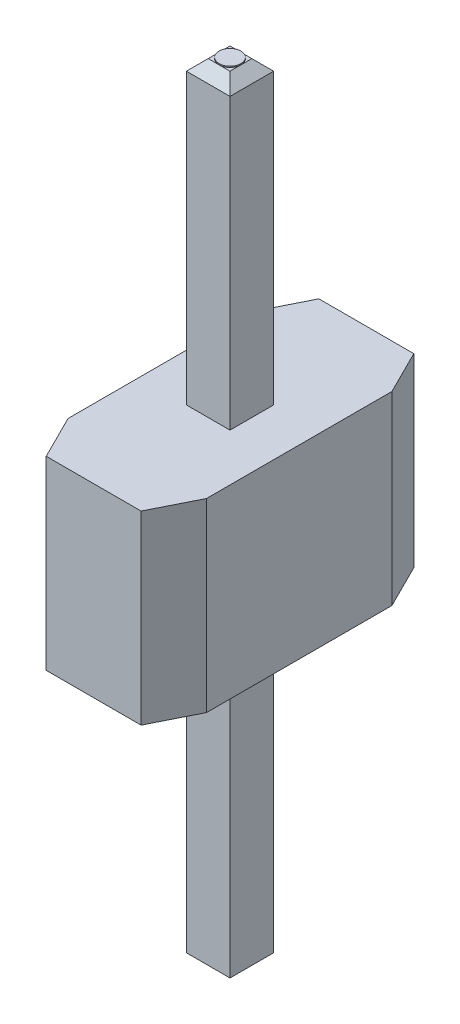
ISO-10303-21;
HEADER;
FILE_DESCRIPTION(('STEP AP214'),'2;1');
FILE_NAME('part.step','',(''),(''),'','','');
FILE_SCHEMA(('AUTOMOTIVE_DESIGN { 1 0 10303 214 1 1 1 1 }'));
ENDSEC;
DATA;
#1=APPLICATION_CONTEXT('core data for automotive mechanical design processes');
#2=APPLICATION_PROTOCOL_DEFINITION('international standard','automotive_design',2000,#1);
#3=PRODUCT_CONTEXT('',#1,'mechanical');
#4=PRODUCT('Part','Part','',(#3));
#5=PRODUCT_RELATED_PRODUCT_CATEGORY('part','',(#4));
#6=PRODUCT_DEFINITION_FORMATION('','',#4);
#7=PRODUCT_DEFINITION_CONTEXT('part definition',#1,'design');
#8=PRODUCT_DEFINITION('design','',#6,#7);
#9=PRODUCT_DEFINITION_SHAPE('','',#8);
#10=(LENGTH_UNIT() NAMED_UNIT(*) SI_UNIT(.MILLI.,.METRE.));
#11=(NAMED_UNIT(*) PLANE_ANGLE_UNIT() SI_UNIT($,.RADIAN.));
#12=(NAMED_UNIT(*) SI_UNIT($,.STERADIAN.) SOLID_ANGLE_UNIT());
#13=UNCERTAINTY_MEASURE_WITH_UNIT(LENGTH_MEASURE(1.E-05),#10,'distance_accuracy_value','');
#14=(GEOMETRIC_REPRESENTATION_CONTEXT(3) GLOBAL_UNCERTAINTY_ASSIGNED_CONTEXT((#13)) GLOBAL_UNIT_ASSIGNED_CONTEXT((#10,
#11,#12)) REPRESENTATION_CONTEXT('',''));
#15=CARTESIAN_POINT('',(0.,0.,0.));
#16=DIRECTION('',(0.,0.,1.));
#17=DIRECTION('',(1.,0.,0.));
#18=AXIS2_PLACEMENT_3D('',#15,#16,#17);
#19=CARTESIAN_POINT('',(0.,4.45,0.));
#20=DIRECTION('',(0.,1.,0.));
#21=DIRECTION('',(0.,0.,1.));
#22=AXIS2_PLACEMENT_3D('',#19,#20,#21);
#23=PLANE('',#22);
#24=CARTESIAN_POINT('',(8.69461584810359,4.45,-1.99434453340186));
#25=DIRECTION('',(0.,1.,0.));
#26=DIRECTION('',(0.,0.,1.));
#27=AXIS2_PLACEMENT_3D('',#24,#25,#26);
#28=CIRCLE('',#27,0.0999999999999994);
#29=CARTESIAN_POINT('',(8.69461584810359,4.45,-1.89434453340186));
#30=VERTEX_POINT('',#29);
#31=CARTESIAN_POINT('',(8.79461584810359,4.45,-1.99434453340186));
#32=VERTEX_POINT('',#31);
#33=EDGE_CURVE('E47',#30,#32,#28,.T.);
#34=ORIENTED_EDGE('',*,*,#33,.F.);
#35=DIRECTION('',(1.,0.,0.));
#36=VECTOR('',#35,1.);
#37=CARTESIAN_POINT('',(0.,4.45,-1.89434453340186));
#38=LINE('',#37,#36);
#39=CARTESIAN_POINT('',(8.79461584810359,4.45,-1.89434453340186));
#40=VERTEX_POINT('',#39);
#41=EDGE_CURVE('E194',#30,#40,#38,.T.);
#42=ORIENTED_EDGE('',*,*,#41,.T.);
#43=DIRECTION('',(0.,0.,-1.));
#44=VECTOR('',#43,1.);
#45=CARTESIAN_POINT('',(8.79461584810359,4.45,0.));
#46=LINE('',#45,#44);
#47=EDGE_CURVE('E207',#40,#32,#46,.T.);
#48=ORIENTED_EDGE('',*,*,#47,.T.);
#49=EDGE_LOOP('',(#34,#42,#48));
#50=FACE_BOUND('',#49,.T.);
#51=ADVANCED_FACE('F36',(#50),#23,.T.);
#52=CARTESIAN_POINT('',(8.69461584810359,4.45,-2.09434453340185));
#53=VERTEX_POINT('',#52);
#54=EDGE_CURVE('E11',#32,#53,#28,.T.);
#55=ORIENTED_EDGE('',*,*,#54,.F.);
#56=CARTESIAN_POINT('',(8.79461584810359,4.45,-2.09434453340185));
#57=VERTEX_POINT('',#56);
#58=EDGE_CURVE('E193',#32,#57,#46,.T.);
#59=ORIENTED_EDGE('',*,*,#58,.T.);
#60=DIRECTION('',(-1.,0.,0.));
#61=VECTOR('',#60,1.);
#62=CARTESIAN_POINT('',(0.,4.45,-2.09434453340185));
#63=LINE('',#62,#61);
#64=EDGE_CURVE('E313',#57,#53,#63,.T.);
#65=ORIENTED_EDGE('',*,*,#64,.T.);
#66=EDGE_LOOP('',(#55,#59,#65));
#67=FACE_BOUND('',#66,.T.);
#68=ADVANCED_FACE('F408',(#67),#23,.T.);
#69=CARTESIAN_POINT('',(8.59461584810359,4.45,-1.99434453340186));
#70=VERTEX_POINT('',#69);
#71=EDGE_CURVE('E45',#53,#70,#28,.T.);
#72=ORIENTED_EDGE('',*,*,#71,.F.);
#73=CARTESIAN_POINT('',(8.59461584810359,4.45,-2.09434453340185));
#74=VERTEX_POINT('',#73);
#75=EDGE_CURVE('E312',#53,#74,#63,.T.);
#76=ORIENTED_EDGE('',*,*,#75,.T.);
#77=DIRECTION('',(0.,0.,1.));
#78=VECTOR('',#77,1.);
#79=CARTESIAN_POINT('',(8.59461584810359,4.45,0.));
#80=LINE('',#79,#78);
#81=EDGE_CURVE('E205',#74,#70,#80,.T.);
#82=ORIENTED_EDGE('',*,*,#81,.T.);
#83=EDGE_LOOP('',(#72,#76,#82));
#84=FACE_BOUND('',#83,.T.);
#85=ADVANCED_FACE('F413',(#84),#23,.T.);
#86=CARTESIAN_POINT('',(9.12961584810359,1.7,-3.24434453340186));
#87=DIRECTION('',(-0.894427190999916,0.,0.447213595499959));
#88=DIRECTION('',(0.447213595499959,0.,0.894427190999916));
#89=AXIS2_PLACEMENT_3D('',#86,#87,#88);
#90=PLANE('',#89);
#91=DIRECTION('',(-0.447213595499959,0.,-0.894427190999915));
#92=VECTOR('',#91,1.);
#93=CARTESIAN_POINT('',(9.12961584810359,0.,-3.24434453340186));
#94=LINE('',#93,#92);
#95=CARTESIAN_POINT('',(9.32961584810359,0.,-2.84434453340186));
#96=VERTEX_POINT('',#95);
#97=CARTESIAN_POINT('',(9.12961584810359,0.,-3.24434453340186));
#98=VERTEX_POINT('',#97);
#99=EDGE_CURVE('E240',#96,#98,#94,.T.);
#100=ORIENTED_EDGE('',*,*,#99,.T.);
#101=DIRECTION('',(0.,-1.,0.));
#102=VECTOR('',#101,1.);
#103=CARTESIAN_POINT('',(9.12961584810359,1.7,-3.24434453340186));
#104=LINE('',#103,#102);
#105=CARTESIAN_POINT('',(9.12961584810359,1.7,-3.24434453340186));
#106=VERTEX_POINT('',#105);
#107=EDGE_CURVE('E295',#106,#98,#104,.T.);
#108=ORIENTED_EDGE('',*,*,#107,.F.);
#109=DIRECTION('',(-0.447213595499959,0.,-0.894427190999915));
#110=VECTOR('',#109,1.);
#111=CARTESIAN_POINT('',(9.12961584810359,1.7,-3.24434453340186));
#112=LINE('',#111,#110);
#113=CARTESIAN_POINT('',(9.32961584810359,1.7,-2.84434453340186));
#114=VERTEX_POINT('',#113);
#115=EDGE_CURVE('E241',#114,#106,#112,.T.);
#116=ORIENTED_EDGE('',*,*,#115,.F.);
#117=DIRECTION('',(0.,-1.,0.));
#118=VECTOR('',#117,1.);
#119=CARTESIAN_POINT('',(9.32961584810359,1.7,-2.84434453340186));
#120=LINE('',#119,#118);
#121=EDGE_CURVE('E259',#114,#96,#120,.T.);
#122=ORIENTED_EDGE('',*,*,#121,.T.);
#123=EDGE_LOOP('',(#100,#108,#116,#122));
#124=FACE_BOUND('',#123,.T.);
#125=ADVANCED_FACE('F428',(#124),#90,.F.);
#126=CARTESIAN_POINT('',(8.25961584810359,1.7,-3.24434453340186));
#127=DIRECTION('',(0.,0.,1.));
#128=DIRECTION('',(1.,0.,0.));
#129=AXIS2_PLACEMENT_3D('',#126,#127,#128);
#130=PLANE('',#129);
#131=DIRECTION('',(-1.,0.,0.));
#132=VECTOR('',#131,1.);
#133=CARTESIAN_POINT('',(8.25961584810359,0.,-3.24434453340186));
#134=LINE('',#133,#132);
#135=CARTESIAN_POINT('',(8.25961584810359,0.,-3.24434453340186));
#136=VERTEX_POINT('',#135);
#137=EDGE_CURVE('E262',#98,#136,#134,.T.);
#138=ORIENTED_EDGE('',*,*,#137,.T.);
#139=DIRECTION('',(0.,-1.,0.));
#140=VECTOR('',#139,1.);
#141=CARTESIAN_POINT('',(8.25961584810359,1.7,-3.24434453340186));
#142=LINE('',#141,#140);
#143=CARTESIAN_POINT('',(8.25961584810359,1.7,-3.24434453340186));
#144=VERTEX_POINT('',#143);
#145=EDGE_CURVE('E292',#144,#136,#142,.T.);
#146=ORIENTED_EDGE('',*,*,#145,.F.);
#147=DIRECTION('',(-1.,0.,0.));
#148=VECTOR('',#147,1.);
#149=CARTESIAN_POINT('',(8.25961584810359,1.7,-3.24434453340186));
#150=LINE('',#149,#148);
#151=EDGE_CURVE('E244',#106,#144,#150,.T.);
#152=ORIENTED_EDGE('',*,*,#151,.F.);
#153=ORIENTED_EDGE('',*,*,#107,.T.);
#154=EDGE_LOOP('',(#138,#146,#152,#153));
#155=FACE_BOUND('',#154,.T.);
#156=ADVANCED_FACE('F432',(#155),#130,.F.);
#157=CARTESIAN_POINT('',(8.25961584810359,1.7,-3.24434453340186));
#158=DIRECTION('',(0.894427190999916,0.,0.447213595499959));
#159=DIRECTION('',(0.447213595499959,0.,-0.894427190999916));
#160=AXIS2_PLACEMENT_3D('',#157,#158,#159);
#161=PLANE('',#160);
#162=DIRECTION('',(-0.447213595499959,0.,0.894427190999915));
#163=VECTOR('',#162,1.);
#164=CARTESIAN_POINT('',(8.25961584810359,0.,-3.24434453340186));
#165=LINE('',#164,#163);
#166=CARTESIAN_POINT('',(8.05961584810359,0.,-2.84434453340186));
#167=VERTEX_POINT('',#166);
#168=EDGE_CURVE('E264',#136,#167,#165,.T.);
#169=ORIENTED_EDGE('',*,*,#168,.T.);
#170=DIRECTION('',(0.,-1.,0.));
#171=VECTOR('',#170,1.);
#172=CARTESIAN_POINT('',(8.05961584810359,1.7,-2.84434453340186));
#173=LINE('',#172,#171);
#174=CARTESIAN_POINT('',(8.05961584810359,1.7,-2.84434453340186));
#175=VERTEX_POINT('',#174);
#176=EDGE_CURVE('E289',#175,#167,#173,.T.);
#177=ORIENTED_EDGE('',*,*,#176,.F.);
#178=DIRECTION('',(-0.447213595499959,0.,0.894427190999915));
#179=VECTOR('',#178,1.);
#180=CARTESIAN_POINT('',(8.25961584810359,1.7,-3.24434453340186));
#181=LINE('',#180,#179);
#182=EDGE_CURVE('E247',#144,#175,#181,.T.);
#183=ORIENTED_EDGE('',*,*,#182,.F.);
#184=ORIENTED_EDGE('',*,*,#145,.T.);
#185=EDGE_LOOP('',(#169,#177,#183,#184));
#186=FACE_BOUND('',#185,.T.);
#187=ADVANCED_FACE('F438',(#186),#161,.F.);
#188=CARTESIAN_POINT('',(8.05961584810359,1.7,-1.14434453340186));
#189=DIRECTION('',(1.,0.,0.));
#190=DIRECTION('',(0.,0.,-1.));
#191=AXIS2_PLACEMENT_3D('',#188,#189,#190);
#192=PLANE('',#191);
#193=DIRECTION('',(0.,0.,1.));
#194=VECTOR('',#193,1.);
#195=CARTESIAN_POINT('',(8.05961584810359,0.,-1.14434453340186));
#196=LINE('',#195,#194);
#197=CARTESIAN_POINT('',(8.05961584810359,0.,-1.14434453340186));
#198=VERTEX_POINT('',#197);
#199=EDGE_CURVE('E266',#167,#198,#196,.T.);
#200=ORIENTED_EDGE('',*,*,#199,.T.);
#201=DIRECTION('',(0.,-1.,0.));
#202=VECTOR('',#201,1.);
#203=CARTESIAN_POINT('',(8.05961584810359,1.7,-1.14434453340186));
#204=LINE('',#203,#202);
#205=CARTESIAN_POINT('',(8.05961584810359,1.7,-1.14434453340186));
#206=VERTEX_POINT('',#205);
#207=EDGE_CURVE('E286',#206,#198,#204,.T.);
#208=ORIENTED_EDGE('',*,*,#207,.F.);
#209=DIRECTION('',(0.,0.,1.));
#210=VECTOR('',#209,1.);
#211=CARTESIAN_POINT('',(8.05961584810359,1.7,-1.14434453340186));
#212=LINE('',#211,#210);
#213=EDGE_CURVE('E249',#175,#206,#212,.T.);
#214=ORIENTED_EDGE('',*,*,#213,.F.);
#215=ORIENTED_EDGE('',*,*,#176,.T.);
#216=EDGE_LOOP('',(#200,#208,#214,#215));
#217=FACE_BOUND('',#216,.T.);
#218=ADVANCED_FACE('F626',(#217),#192,.F.);
#219=CARTESIAN_POINT('',(8.05961584810359,1.7,-1.14434453340186));
#220=DIRECTION('',(0.894427190999915,0.,-0.447213595499959));
#221=DIRECTION('',(-0.447213595499959,0.,-0.894427190999915));
#222=AXIS2_PLACEMENT_3D('',#219,#220,#221);
#223=PLANE('',#222);
#224=DIRECTION('',(0.447213595499959,0.,0.894427190999915));
#225=VECTOR('',#224,1.);
#226=CARTESIAN_POINT('',(8.05961584810359,0.,-1.14434453340186));
#227=LINE('',#226,#225);
#228=CARTESIAN_POINT('',(8.25961584810359,0.,-0.744344533401855));
#229=VERTEX_POINT('',#228);
#230=EDGE_CURVE('E268',#198,#229,#227,.T.);
#231=ORIENTED_EDGE('',*,*,#230,.T.);
#232=DIRECTION('',(0.,-1.,0.));
#233=VECTOR('',#232,1.);
#234=CARTESIAN_POINT('',(8.25961584810359,1.7,-0.744344533401855));
#235=LINE('',#234,#233);
#236=CARTESIAN_POINT('',(8.25961584810359,1.7,-0.744344533401855));
#237=VERTEX_POINT('',#236);
#238=EDGE_CURVE('E283',#237,#229,#235,.T.);
#239=ORIENTED_EDGE('',*,*,#238,.F.);
#240=DIRECTION('',(0.447213595499959,0.,0.894427190999915));
#241=VECTOR('',#240,1.);
#242=CARTESIAN_POINT('',(8.05961584810359,1.7,-1.14434453340186));
#243=LINE('',#242,#241);
#244=EDGE_CURVE('E251',#206,#237,#243,.T.);
#245=ORIENTED_EDGE('',*,*,#244,.F.);
#246=ORIENTED_EDGE('',*,*,#207,.T.);
#247=EDGE_LOOP('',(#231,#239,#245,#246));
#248=FACE_BOUND('',#247,.T.);
#249=ADVANCED_FACE('F622',(#248),#223,.F.);
#250=CARTESIAN_POINT('',(9.12961584810359,1.7,-0.744344533401855));
#251=DIRECTION('',(0.,0.,-1.));
#252=DIRECTION('',(-1.,0.,0.));
#253=AXIS2_PLACEMENT_3D('',#250,#251,#252);
#254=PLANE('',#253);
#255=DIRECTION('',(1.,0.,0.));
#256=VECTOR('',#255,1.);
#257=CARTESIAN_POINT('',(9.12961584810359,0.,-0.744344533401855));
#258=LINE('',#257,#256);
#259=CARTESIAN_POINT('',(9.12961584810359,0.,-0.744344533401855));
#260=VERTEX_POINT('',#259);
#261=EDGE_CURVE('E270',#229,#260,#258,.T.);
#262=ORIENTED_EDGE('',*,*,#261,.T.);
#263=DIRECTION('',(0.,-1.,0.));
#264=VECTOR('',#263,1.);
#265=CARTESIAN_POINT('',(9.12961584810359,1.7,-0.744344533401855));
#266=LINE('',#265,#264);
#267=CARTESIAN_POINT('',(9.12961584810359,1.7,-0.744344533401855));
#268=VERTEX_POINT('',#267);
#269=EDGE_CURVE('E280',#268,#260,#266,.T.);
#270=ORIENTED_EDGE('',*,*,#269,.F.);
#271=DIRECTION('',(1.,0.,0.));
#272=VECTOR('',#271,1.);
#273=CARTESIAN_POINT('',(9.12961584810359,1.7,-0.744344533401855));
#274=LINE('',#273,#272);
#275=EDGE_CURVE('E253',#237,#268,#274,.T.);
#276=ORIENTED_EDGE('',*,*,#275,.F.);
#277=ORIENTED_EDGE('',*,*,#238,.T.);
#278=EDGE_LOOP('',(#262,#270,#276,#277));
#279=FACE_BOUND('',#278,.T.);
#280=ADVANCED_FACE('F618',(#279),#254,.F.);
#281=CARTESIAN_POINT('',(9.12961584810359,1.7,-0.744344533401855));
#282=DIRECTION('',(-0.894427190999915,0.,-0.447213595499959));
#283=DIRECTION('',(-0.447213595499959,0.,0.894427190999915));
#284=AXIS2_PLACEMENT_3D('',#281,#282,#283);
#285=PLANE('',#284);
#286=DIRECTION('',(0.447213595499959,0.,-0.894427190999915));
#287=VECTOR('',#286,1.);
#288=CARTESIAN_POINT('',(9.12961584810359,0.,-0.744344533401855));
#289=LINE('',#288,#287);
#290=CARTESIAN_POINT('',(9.32961584810359,0.,-1.14434453340186));
#291=VERTEX_POINT('',#290);
#292=EDGE_CURVE('E272',#260,#291,#289,.T.);
#293=ORIENTED_EDGE('',*,*,#292,.T.);
#294=DIRECTION('',(0.,-1.,0.));
#295=VECTOR('',#294,1.);
#296=CARTESIAN_POINT('',(9.32961584810359,1.7,-1.14434453340186));
#297=LINE('',#296,#295);
#298=CARTESIAN_POINT('',(9.32961584810359,1.7,-1.14434453340186));
#299=VERTEX_POINT('',#298);
#300=EDGE_CURVE('E277',#299,#291,#297,.T.);
#301=ORIENTED_EDGE('',*,*,#300,.F.);
#302=DIRECTION('',(0.447213595499959,0.,-0.894427190999915));
#303=VECTOR('',#302,1.);
#304=CARTESIAN_POINT('',(9.12961584810359,1.7,-0.744344533401855));
#305=LINE('',#304,#303);
#306=EDGE_CURVE('E255',#268,#299,#305,.T.);
#307=ORIENTED_EDGE('',*,*,#306,.F.);
#308=ORIENTED_EDGE('',*,*,#269,.T.);
#309=EDGE_LOOP('',(#293,#301,#307,#308));
#310=FACE_BOUND('',#309,.T.);
#311=ADVANCED_FACE('F614',(#310),#285,.F.);
#312=CARTESIAN_POINT('',(9.32961584810359,1.7,-2.84434453340186));
#313=DIRECTION('',(-1.,0.,0.));
#314=DIRECTION('',(0.,0.,1.));
#315=AXIS2_PLACEMENT_3D('',#312,#313,#314);
#316=PLANE('',#315);
#317=DIRECTION('',(0.,0.,-1.));
#318=VECTOR('',#317,1.);
#319=CARTESIAN_POINT('',(9.32961584810359,0.,-2.84434453340186));
#320=LINE('',#319,#318);
#321=EDGE_CURVE('E245',#291,#96,#320,.T.);
#322=ORIENTED_EDGE('',*,*,#321,.T.);
#323=ORIENTED_EDGE('',*,*,#121,.F.);
#324=DIRECTION('',(0.,0.,-1.));
#325=VECTOR('',#324,1.);
#326=CARTESIAN_POINT('',(9.32961584810359,1.7,-2.84434453340186));
#327=LINE('',#326,#325);
#328=EDGE_CURVE('E257',#299,#114,#327,.T.);
#329=ORIENTED_EDGE('',*,*,#328,.F.);
#330=ORIENTED_EDGE('',*,*,#300,.T.);
#331=EDGE_LOOP('',(#322,#323,#329,#330));
#332=FACE_BOUND('',#331,.T.);
#333=ADVANCED_FACE('F609',(#332),#316,.F.);
#334=CARTESIAN_POINT('',(0.,1.7,0.));
#335=DIRECTION('',(0.,-1.,0.));
#336=DIRECTION('',(0.,0.,-1.));
#337=AXIS2_PLACEMENT_3D('',#334,#335,#336);
#338=PLANE('',#337);
#339=DIRECTION('',(1.,0.,0.));
#340=VECTOR('',#339,1.);
#341=CARTESIAN_POINT('',(0.,1.7,-2.19434453340186));
#342=LINE('',#341,#340);
#343=CARTESIAN_POINT('',(8.49461584810359,1.7,-2.19434453340186));
#344=VERTEX_POINT('',#343);
#345=CARTESIAN_POINT('',(8.89461584810359,1.7,-2.19434453340186));
#346=VERTEX_POINT('',#345);
#347=EDGE_CURVE('E218',#344,#346,#342,.T.);
#348=ORIENTED_EDGE('',*,*,#347,.T.);
#349=DIRECTION('',(0.,0.,1.));
#350=VECTOR('',#349,1.);
#351=CARTESIAN_POINT('',(8.89461584810359,1.7,0.));
#352=LINE('',#351,#350);
#353=CARTESIAN_POINT('',(8.89461584810359,1.7,-1.79434453340186));
#354=VERTEX_POINT('',#353);
#355=EDGE_CURVE('E237',#346,#354,#352,.T.);
#356=ORIENTED_EDGE('',*,*,#355,.T.);
#357=DIRECTION('',(-1.,0.,0.));
#358=VECTOR('',#357,1.);
#359=CARTESIAN_POINT('',(0.,1.7,-1.79434453340186));
#360=LINE('',#359,#358);
#361=CARTESIAN_POINT('',(8.49461584810359,1.7,-1.79434453340186));
#362=VERTEX_POINT('',#361);
#363=EDGE_CURVE('E234',#354,#362,#360,.T.);
#364=ORIENTED_EDGE('',*,*,#363,.T.);
#365=DIRECTION('',(0.,0.,-1.));
#366=VECTOR('',#365,1.);
#367=CARTESIAN_POINT('',(8.49461584810359,1.7,0.));
#368=LINE('',#367,#366);
#369=EDGE_CURVE('E231',#362,#344,#368,.T.);
#370=ORIENTED_EDGE('',*,*,#369,.T.);
#371=EDGE_LOOP('',(#348,#356,#364,#370));
#372=FACE_BOUND('',#371,.T.);
#373=ORIENTED_EDGE('',*,*,#115,.T.);
#374=ORIENTED_EDGE('',*,*,#151,.T.);
#375=ORIENTED_EDGE('',*,*,#182,.T.);
#376=ORIENTED_EDGE('',*,*,#213,.T.);
#377=ORIENTED_EDGE('',*,*,#244,.T.);
#378=ORIENTED_EDGE('',*,*,#275,.T.);
#379=ORIENTED_EDGE('',*,*,#306,.T.);
#380=ORIENTED_EDGE('',*,*,#328,.T.);
#381=EDGE_LOOP('',(#373,#374,#375,#376,#377,#378,#379,#380));
#382=FACE_BOUND('',#381,.T.);
#383=ADVANCED_FACE('F606',(#372,#382),#338,.F.);
#384=CARTESIAN_POINT('',(0.,0.,0.));
#385=DIRECTION('',(0.,-1.,0.));
#386=DIRECTION('',(0.,0.,-1.));
#387=AXIS2_PLACEMENT_3D('',#384,#385,#386);
#388=PLANE('',#387);
#389=DIRECTION('',(0.,0.,1.));
#390=VECTOR('',#389,1.);
#391=CARTESIAN_POINT('',(8.89461584810359,0.,0.));
#392=LINE('',#391,#390);
#393=CARTESIAN_POINT('',(8.89461584810359,0.,-2.19434453340186));
#394=VERTEX_POINT('',#393);
#395=CARTESIAN_POINT('',(8.89461584810359,0.,-1.79434453340186));
#396=VERTEX_POINT('',#395);
#397=EDGE_CURVE('E307',#394,#396,#392,.T.);
#398=ORIENTED_EDGE('',*,*,#397,.F.);
#399=DIRECTION('',(1.,0.,0.));
#400=VECTOR('',#399,1.);
#401=CARTESIAN_POINT('',(0.,0.,-2.19434453340186));
#402=LINE('',#401,#400);
#403=CARTESIAN_POINT('',(8.49461584810359,0.,-2.19434453340186));
#404=VERTEX_POINT('',#403);
#405=EDGE_CURVE('E298',#404,#394,#402,.T.);
#406=ORIENTED_EDGE('',*,*,#405,.F.);
#407=DIRECTION('',(0.,0.,-1.));
#408=VECTOR('',#407,1.);
#409=CARTESIAN_POINT('',(8.49461584810359,0.,0.));
#410=LINE('',#409,#408);
#411=CARTESIAN_POINT('',(8.49461584810359,0.,-1.79434453340186));
#412=VERTEX_POINT('',#411);
#413=EDGE_CURVE('E301',#412,#404,#410,.T.);
#414=ORIENTED_EDGE('',*,*,#413,.F.);
#415=DIRECTION('',(-1.,0.,0.));
#416=VECTOR('',#415,1.);
#417=CARTESIAN_POINT('',(0.,0.,-1.79434453340186));
#418=LINE('',#417,#416);
#419=EDGE_CURVE('E304',#396,#412,#418,.T.);
#420=ORIENTED_EDGE('',*,*,#419,.F.);
#421=EDGE_LOOP('',(#398,#406,#414,#420));
#422=FACE_BOUND('',#421,.T.);
#423=ORIENTED_EDGE('',*,*,#99,.F.);
#424=ORIENTED_EDGE('',*,*,#321,.F.);
#425=ORIENTED_EDGE('',*,*,#292,.F.);
#426=ORIENTED_EDGE('',*,*,#261,.F.);
#427=ORIENTED_EDGE('',*,*,#230,.F.);
#428=ORIENTED_EDGE('',*,*,#199,.F.);
#429=ORIENTED_EDGE('',*,*,#168,.F.);
#430=ORIENTED_EDGE('',*,*,#137,.F.);
#431=EDGE_LOOP('',(#423,#424,#425,#426,#427,#428,#429,#430));
#432=FACE_BOUND('',#431,.T.);
#433=ADVANCED_FACE('F386',(#422,#432),#388,.T.);
#434=CARTESIAN_POINT('',(0.,-2.75,0.));
#435=DIRECTION('',(0.,1.,0.));
#436=DIRECTION('',(0.,0.,1.));
#437=AXIS2_PLACEMENT_3D('',#434,#435,#436);
#438=PLANE('',#437);
#439=DIRECTION('',(1.,0.,0.));
#440=VECTOR('',#439,1.);
#441=CARTESIAN_POINT('',(8.89461584810359,-2.75,-2.09434453340186));
#442=LINE('',#441,#440);
#443=CARTESIAN_POINT('',(8.59461584810359,-2.75,-2.09434453340186));
#444=VERTEX_POINT('',#443);
#445=CARTESIAN_POINT('',(8.79461584810359,-2.75,-2.09434453340186));
#446=VERTEX_POINT('',#445);
#447=EDGE_CURVE('E336',#444,#446,#442,.T.);
#448=ORIENTED_EDGE('',*,*,#447,.T.);
#449=DIRECTION('',(0.,0.,1.));
#450=VECTOR('',#449,1.);
#451=CARTESIAN_POINT('',(8.79461584810359,-2.75,-1.79434453340186));
#452=LINE('',#451,#450);
#453=CARTESIAN_POINT('',(8.79461584810359,-2.75,-1.89434453340185));
#454=VERTEX_POINT('',#453);
#455=EDGE_CURVE('E342',#446,#454,#452,.T.);
#456=ORIENTED_EDGE('',*,*,#455,.T.);
#457=DIRECTION('',(-1.,0.,0.));
#458=VECTOR('',#457,1.);
#459=CARTESIAN_POINT('',(8.49461584810359,-2.75,-1.89434453340185));
#460=LINE('',#459,#458);
#461=CARTESIAN_POINT('',(8.59461584810359,-2.75,-1.89434453340185));
#462=VERTEX_POINT('',#461);
#463=EDGE_CURVE('E340',#454,#462,#460,.T.);
#464=ORIENTED_EDGE('',*,*,#463,.T.);
#465=DIRECTION('',(0.,0.,-1.));
#466=VECTOR('',#465,1.);
#467=CARTESIAN_POINT('',(8.59461584810359,-2.75,-2.19434453340186));
#468=LINE('',#467,#466);
#469=EDGE_CURVE('E338',#462,#444,#468,.T.);
#470=ORIENTED_EDGE('',*,*,#469,.T.);
#471=EDGE_LOOP('',(#448,#456,#464,#470));
#472=FACE_BOUND('',#471,.T.);
#473=ADVANCED_FACE('F368',(#472),#438,.F.);
#474=CARTESIAN_POINT('',(8.69461584810359,-2.75,-2.19434453340186));
#475=DIRECTION('',(0.,0.,-1.));
#476=DIRECTION('',(-1.,0.,0.));
#477=AXIS2_PLACEMENT_3D('',#474,#475,#476);
#478=PLANE('',#477);
#479=DIRECTION('',(0.,1.,0.));
#480=VECTOR('',#479,1.);
#481=CARTESIAN_POINT('',(8.89461584810359,-2.75,-2.19434453340186));
#482=LINE('',#481,#480);
#483=CARTESIAN_POINT('',(8.89461584810359,-2.65,-2.19434453340186));
#484=VERTEX_POINT('',#483);
#485=EDGE_CURVE('E216',#484,#394,#482,.T.);
#486=ORIENTED_EDGE('',*,*,#485,.F.);
#487=DIRECTION('',(-1.,0.,0.));
#488=VECTOR('',#487,1.);
#489=CARTESIAN_POINT('',(8.49461584810359,-2.65,-2.19434453340186));
#490=LINE('',#489,#488);
#491=CARTESIAN_POINT('',(8.49461584810359,-2.65,-2.19434453340186));
#492=VERTEX_POINT('',#491);
#493=EDGE_CURVE('E211',#484,#492,#490,.T.);
#494=ORIENTED_EDGE('',*,*,#493,.T.);
#495=DIRECTION('',(0.,1.,0.));
#496=VECTOR('',#495,1.);
#497=CARTESIAN_POINT('',(8.49461584810359,-2.75,-2.19434453340186));
#498=LINE('',#497,#496);
#499=EDGE_CURVE('E226',#492,#404,#498,.T.);
#500=ORIENTED_EDGE('',*,*,#499,.T.);
#501=ORIENTED_EDGE('',*,*,#405,.T.);
#502=EDGE_LOOP('',(#486,#494,#500,#501));
#503=FACE_BOUND('',#502,.T.);
#504=ADVANCED_FACE('F382',(#503),#478,.T.);
#505=CARTESIAN_POINT('',(8.49461584810359,-2.75,-2.19434453340186));
#506=DIRECTION('',(-1.,0.,0.));
#507=DIRECTION('',(0.,0.,1.));
#508=AXIS2_PLACEMENT_3D('',#505,#506,#507);
#509=PLANE('',#508);
#510=ORIENTED_EDGE('',*,*,#499,.F.);
#511=DIRECTION('',(0.,0.,1.));
#512=VECTOR('',#511,1.);
#513=CARTESIAN_POINT('',(8.49461584810359,-2.65,-1.79434453340186));
#514=LINE('',#513,#512);
#515=CARTESIAN_POINT('',(8.49461584810359,-2.65,-1.79434453340186));
#516=VERTEX_POINT('',#515);
#517=EDGE_CURVE('E212',#492,#516,#514,.T.);
#518=ORIENTED_EDGE('',*,*,#517,.T.);
#519=DIRECTION('',(0.,1.,0.));
#520=VECTOR('',#519,1.);
#521=CARTESIAN_POINT('',(8.49461584810359,-2.75,-1.79434453340186));
#522=LINE('',#521,#520);
#523=EDGE_CURVE('E223',#516,#412,#522,.T.);
#524=ORIENTED_EDGE('',*,*,#523,.T.);
#525=ORIENTED_EDGE('',*,*,#413,.T.);
#526=EDGE_LOOP('',(#510,#518,#524,#525));
#527=FACE_BOUND('',#526,.T.);
#528=ADVANCED_FACE('F390',(#527),#509,.T.);
#529=CARTESIAN_POINT('',(8.49461584810359,-2.75,-1.79434453340186));
#530=DIRECTION('',(0.,0.,1.));
#531=DIRECTION('',(1.,0.,0.));
#532=AXIS2_PLACEMENT_3D('',#529,#530,#531);
#533=PLANE('',#532);
#534=ORIENTED_EDGE('',*,*,#523,.F.);
#535=DIRECTION('',(1.,0.,0.));
#536=VECTOR('',#535,1.);
#537=CARTESIAN_POINT('',(8.89461584810359,-2.65,-1.79434453340186));
#538=LINE('',#537,#536);
#539=CARTESIAN_POINT('',(8.89461584810359,-2.65,-1.79434453340186));
#540=VERTEX_POINT('',#539);
#541=EDGE_CURVE('E345',#516,#540,#538,.T.);
#542=ORIENTED_EDGE('',*,*,#541,.T.);
#543=DIRECTION('',(0.,1.,0.));
#544=VECTOR('',#543,1.);
#545=CARTESIAN_POINT('',(8.89461584810359,-2.75,-1.79434453340186));
#546=LINE('',#545,#544);
#547=EDGE_CURVE('E220',#540,#396,#546,.T.);
#548=ORIENTED_EDGE('',*,*,#547,.T.);
#549=ORIENTED_EDGE('',*,*,#419,.T.);
#550=EDGE_LOOP('',(#534,#542,#548,#549));
#551=FACE_BOUND('',#550,.T.);
#552=ADVANCED_FACE('F393',(#551),#533,.T.);
#553=CARTESIAN_POINT('',(8.89461584810359,-2.75,-1.79434453340186));
#554=DIRECTION('',(1.,0.,0.));
#555=DIRECTION('',(0.,0.,-1.));
#556=AXIS2_PLACEMENT_3D('',#553,#554,#555);
#557=PLANE('',#556);
#558=ORIENTED_EDGE('',*,*,#547,.F.);
#559=DIRECTION('',(0.,0.,-1.));
#560=VECTOR('',#559,1.);
#561=CARTESIAN_POINT('',(8.89461584810359,-2.65,-2.19434453340186));
#562=LINE('',#561,#560);
#563=EDGE_CURVE('E325',#540,#484,#562,.T.);
#564=ORIENTED_EDGE('',*,*,#563,.T.);
#565=ORIENTED_EDGE('',*,*,#485,.T.);
#566=ORIENTED_EDGE('',*,*,#397,.T.);
#567=EDGE_LOOP('',(#558,#564,#565,#566));
#568=FACE_BOUND('',#567,.T.);
#569=ADVANCED_FACE('F380',(#568),#557,.T.);
#570=CARTESIAN_POINT('',(8.89461584810359,4.35,-2.19434453340186));
#571=VERTEX_POINT('',#570);
#572=EDGE_CURVE('E219',#346,#571,#482,.T.);
#573=ORIENTED_EDGE('',*,*,#572,.T.);
#574=DIRECTION('',(0.,0.,1.));
#575=VECTOR('',#574,1.);
#576=CARTESIAN_POINT('',(8.89461584810359,4.35,-1.79434453340186));
#577=LINE('',#576,#575);
#578=CARTESIAN_POINT('',(8.89461584810359,4.35,-1.79434453340186));
#579=VERTEX_POINT('',#578);
#580=EDGE_CURVE('E319',#571,#579,#577,.T.);
#581=ORIENTED_EDGE('',*,*,#580,.T.);
#582=EDGE_CURVE('E222',#354,#579,#546,.T.);
#583=ORIENTED_EDGE('',*,*,#582,.F.);
#584=ORIENTED_EDGE('',*,*,#355,.F.);
#585=EDGE_LOOP('',(#573,#581,#583,#584));
#586=FACE_BOUND('',#585,.T.);
#587=ADVANCED_FACE('F401',(#586),#557,.T.);
#588=ORIENTED_EDGE('',*,*,#582,.T.);
#589=DIRECTION('',(-1.,0.,0.));
#590=VECTOR('',#589,1.);
#591=CARTESIAN_POINT('',(8.49461584810359,4.35,-1.79434453340186));
#592=LINE('',#591,#590);
#593=CARTESIAN_POINT('',(8.49461584810359,4.35,-1.79434453340186));
#594=VERTEX_POINT('',#593);
#595=EDGE_CURVE('E321',#579,#594,#592,.T.);
#596=ORIENTED_EDGE('',*,*,#595,.T.);
#597=EDGE_CURVE('E225',#362,#594,#522,.T.);
#598=ORIENTED_EDGE('',*,*,#597,.F.);
#599=ORIENTED_EDGE('',*,*,#363,.F.);
#600=EDGE_LOOP('',(#588,#596,#598,#599));
#601=FACE_BOUND('',#600,.T.);
#602=ADVANCED_FACE('F396',(#601),#533,.T.);
#603=ORIENTED_EDGE('',*,*,#597,.T.);
#604=DIRECTION('',(0.,0.,-1.));
#605=VECTOR('',#604,1.);
#606=CARTESIAN_POINT('',(8.49461584810359,4.35,-2.19434453340186));
#607=LINE('',#606,#605);
#608=CARTESIAN_POINT('',(8.49461584810359,4.35,-2.19434453340186));
#609=VERTEX_POINT('',#608);
#610=EDGE_CURVE('E323',#594,#609,#607,.T.);
#611=ORIENTED_EDGE('',*,*,#610,.T.);
#612=EDGE_CURVE('E228',#344,#609,#498,.T.);
#613=ORIENTED_EDGE('',*,*,#612,.F.);
#614=ORIENTED_EDGE('',*,*,#369,.F.);
#615=EDGE_LOOP('',(#603,#611,#613,#614));
#616=FACE_BOUND('',#615,.T.);
#617=ADVANCED_FACE('F404',(#616),#509,.T.);
#618=ORIENTED_EDGE('',*,*,#612,.T.);
#619=DIRECTION('',(1.,0.,0.));
#620=VECTOR('',#619,1.);
#621=CARTESIAN_POINT('',(8.69461584810359,4.35,-2.19434453340186));
#622=LINE('',#621,#620);
#623=EDGE_CURVE('E316',#609,#571,#622,.T.);
#624=ORIENTED_EDGE('',*,*,#623,.T.);
#625=ORIENTED_EDGE('',*,*,#572,.F.);
#626=ORIENTED_EDGE('',*,*,#347,.F.);
#627=EDGE_LOOP('',(#618,#624,#625,#626));
#628=FACE_BOUND('',#627,.T.);
#629=ADVANCED_FACE('F418',(#628),#478,.T.);
#630=EDGE_CURVE('E54',#70,#30,#28,.T.);
#631=ORIENTED_EDGE('',*,*,#630,.F.);
#632=CARTESIAN_POINT('',(8.59461584810359,4.45,-1.89434453340186));
#633=VERTEX_POINT('',#632);
#634=EDGE_CURVE('E189',#70,#633,#80,.T.);
#635=ORIENTED_EDGE('',*,*,#634,.T.);
#636=EDGE_CURVE('E186',#633,#30,#38,.T.);
#637=ORIENTED_EDGE('',*,*,#636,.T.);
#638=EDGE_LOOP('',(#631,#635,#637));
#639=FACE_BOUND('',#638,.T.);
#640=ADVANCED_FACE('F188',(#639),#23,.T.);
#641=CARTESIAN_POINT('',(0.,4.45,-1.89434453340186));
#642=DIRECTION('',(0.,-0.707106781186547,-0.707106781186547));
#643=DIRECTION('',(1.,0.,0.));
#644=AXIS2_PLACEMENT_3D('',#641,#642,#643);
#645=PLANE('',#644);
#646=DIRECTION('',(0.577350269189626,0.577350269189626,-0.577350269189626));
#647=VECTOR('',#646,1.);
#648=CARTESIAN_POINT('',(7.96316767030297,3.81855182219938,-1.26289635560124));
#649=LINE('',#648,#647);
#650=EDGE_CURVE('E331',#594,#633,#649,.T.);
#651=ORIENTED_EDGE('',*,*,#650,.F.);
#652=ORIENTED_EDGE('',*,*,#595,.F.);
#653=DIRECTION('',(-0.577350269189626,0.577350269189626,-0.577350269189626));
#654=VECTOR('',#653,1.);
#655=CARTESIAN_POINT('',(5.86307723206906,7.38153861603453,-4.82588314943639));
#656=LINE('',#655,#654);
#657=EDGE_CURVE('E201',#40,#579,#656,.F.);
#658=ORIENTED_EDGE('',*,*,#657,.F.);
#659=ORIENTED_EDGE('',*,*,#41,.F.);
#660=ORIENTED_EDGE('',*,*,#636,.F.);
#661=EDGE_LOOP('',(#651,#652,#658,#659,#660));
#662=FACE_BOUND('',#661,.T.);
#663=ADVANCED_FACE('F198',(#662),#645,.F.);
#664=CARTESIAN_POINT('',(8.79461584810359,4.45,0.));
#665=DIRECTION('',(-0.707106781186547,-0.707106781186547,0.));
#666=DIRECTION('',(0.,0.,-1.));
#667=AXIS2_PLACEMENT_3D('',#664,#665,#666);
#668=PLANE('',#667);
#669=ORIENTED_EDGE('',*,*,#657,.T.);
#670=ORIENTED_EDGE('',*,*,#580,.F.);
#671=DIRECTION('',(-0.577350269189626,0.577350269189626,0.577350269189626));
#672=VECTOR('',#671,1.);
#673=CARTESIAN_POINT('',(8.09650100363631,5.14811484446729,-1.39622968893457));
#674=LINE('',#673,#672);
#675=EDGE_CURVE('E329',#57,#571,#674,.F.);
#676=ORIENTED_EDGE('',*,*,#675,.F.);
#677=ORIENTED_EDGE('',*,*,#58,.F.);
#678=ORIENTED_EDGE('',*,*,#47,.F.);
#679=EDGE_LOOP('',(#669,#670,#676,#677,#678));
#680=FACE_BOUND('',#679,.T.);
#681=ADVANCED_FACE('F423',(#680),#668,.F.);
#682=CARTESIAN_POINT('',(8.59461584810359,4.45,0.));
#683=DIRECTION('',(0.707106781186547,-0.707106781186547,0.));
#684=DIRECTION('',(0.,0.,1.));
#685=AXIS2_PLACEMENT_3D('',#682,#683,#684);
#686=PLANE('',#685);
#687=ORIENTED_EDGE('',*,*,#650,.T.);
#688=ORIENTED_EDGE('',*,*,#634,.F.);
#689=ORIENTED_EDGE('',*,*,#81,.F.);
#690=DIRECTION('',(-0.577350269189626,-0.577350269189626,-0.577350269189626));
#691=VECTOR('',#690,1.);
#692=CARTESIAN_POINT('',(9.29273069257088,5.14811484446729,-1.39622968893457));
#693=LINE('',#692,#691);
#694=EDGE_CURVE('E326',#609,#74,#693,.F.);
#695=ORIENTED_EDGE('',*,*,#694,.F.);
#696=ORIENTED_EDGE('',*,*,#610,.F.);
#697=EDGE_LOOP('',(#687,#688,#689,#695,#696));
#698=FACE_BOUND('',#697,.T.);
#699=ADVANCED_FACE('F446',(#698),#686,.F.);
#700=CARTESIAN_POINT('',(0.,4.45,-2.09434453340185));
#701=DIRECTION('',(0.,-0.707106781186547,0.707106781186547));
#702=DIRECTION('',(-1.,0.,0.));
#703=AXIS2_PLACEMENT_3D('',#700,#701,#702);
#704=PLANE('',#703);
#705=ORIENTED_EDGE('',*,*,#675,.T.);
#706=ORIENTED_EDGE('',*,*,#623,.F.);
#707=ORIENTED_EDGE('',*,*,#694,.T.);
#708=ORIENTED_EDGE('',*,*,#75,.F.);
#709=ORIENTED_EDGE('',*,*,#64,.F.);
#710=EDGE_LOOP('',(#705,#706,#707,#708,#709));
#711=FACE_BOUND('',#710,.T.);
#712=ADVANCED_FACE('F443',(#711),#704,.F.);
#713=CARTESIAN_POINT('',(8.49461584810359,-2.65,-2.19434453340186));
#714=DIRECTION('',(-0.707106781186541,-0.707106781186554,0.));
#715=DIRECTION('',(0.,0.,-1.));
#716=AXIS2_PLACEMENT_3D('',#713,#714,#715);
#717=PLANE('',#716);
#718=DIRECTION('',(-0.577350269189631,0.577350269189621,-0.577350269189626));
#719=VECTOR('',#718,1.);
#720=CARTESIAN_POINT('',(8.56128251477026,-2.71666666666667,-2.12767786673519));
#721=LINE('',#720,#719);
#722=EDGE_CURVE('E351',#444,#492,#721,.T.);
#723=ORIENTED_EDGE('',*,*,#722,.F.);
#724=ORIENTED_EDGE('',*,*,#469,.F.);
#725=DIRECTION('',(-0.577350269189631,0.577350269189621,0.577350269189626));
#726=VECTOR('',#725,1.);
#727=CARTESIAN_POINT('',(8.62794918143693,-2.78333333333333,-1.92767786673519));
#728=LINE('',#727,#726);
#729=EDGE_CURVE('E40',#516,#462,#728,.F.);
#730=ORIENTED_EDGE('',*,*,#729,.F.);
#731=ORIENTED_EDGE('',*,*,#517,.F.);
#732=EDGE_LOOP('',(#723,#724,#730,#731));
#733=FACE_BOUND('',#732,.T.);
#734=ADVANCED_FACE('F38',(#733),#717,.T.);
#735=CARTESIAN_POINT('',(8.49461584810359,-2.65,-1.79434453340186));
#736=DIRECTION('',(0.,-0.707106781186551,0.707106781186544));
#737=DIRECTION('',(-1.,0.,0.));
#738=AXIS2_PLACEMENT_3D('',#735,#736,#737);
#739=PLANE('',#738);
#740=ORIENTED_EDGE('',*,*,#729,.T.);
#741=ORIENTED_EDGE('',*,*,#463,.F.);
#742=DIRECTION('',(0.577350269189624,0.577350269189624,0.577350269189629));
#743=VECTOR('',#742,1.);
#744=CARTESIAN_POINT('',(8.76128251477026,-2.78333333333333,-1.92767786673519));
#745=LINE('',#744,#743);
#746=EDGE_CURVE('E350',#540,#454,#745,.F.);
#747=ORIENTED_EDGE('',*,*,#746,.F.);
#748=ORIENTED_EDGE('',*,*,#541,.F.);
#749=EDGE_LOOP('',(#740,#741,#747,#748));
#750=FACE_BOUND('',#749,.T.);
#751=ADVANCED_FACE('F362',(#750),#739,.T.);
#752=CARTESIAN_POINT('',(8.69461584810359,-2.65,-2.19434453340186));
#753=DIRECTION('',(0.,-0.707106781186551,-0.707106781186544));
#754=DIRECTION('',(1.,0.,0.));
#755=AXIS2_PLACEMENT_3D('',#752,#753,#754);
#756=PLANE('',#755);
#757=ORIENTED_EDGE('',*,*,#722,.T.);
#758=ORIENTED_EDGE('',*,*,#493,.F.);
#759=DIRECTION('',(-0.577350269189624,-0.577350269189624,0.577350269189629));
#760=VECTOR('',#759,1.);
#761=CARTESIAN_POINT('',(8.82794918143692,-2.71666666666667,-2.12767786673519));
#762=LINE('',#761,#760);
#763=EDGE_CURVE('E348',#446,#484,#762,.F.);
#764=ORIENTED_EDGE('',*,*,#763,.F.);
#765=ORIENTED_EDGE('',*,*,#447,.F.);
#766=EDGE_LOOP('',(#757,#758,#764,#765));
#767=FACE_BOUND('',#766,.T.);
#768=ADVANCED_FACE('F374',(#767),#756,.T.);
#769=CARTESIAN_POINT('',(8.89461584810359,-2.65,-1.79434453340186));
#770=DIRECTION('',(0.707106781186547,-0.707106781186547,0.));
#771=DIRECTION('',(0.,0.,1.));
#772=AXIS2_PLACEMENT_3D('',#769,#770,#771);
#773=PLANE('',#772);
#774=ORIENTED_EDGE('',*,*,#746,.T.);
#775=ORIENTED_EDGE('',*,*,#455,.F.);
#776=ORIENTED_EDGE('',*,*,#763,.T.);
#777=ORIENTED_EDGE('',*,*,#563,.F.);
#778=EDGE_LOOP('',(#774,#775,#776,#777));
#779=FACE_BOUND('',#778,.T.);
#780=ADVANCED_FACE('F372',(#779),#773,.T.);
#781=CARTESIAN_POINT('',(8.69461584810359,4.46,-1.99434453340186));
#782=DIRECTION('',(0.,-1.,0.));
#783=DIRECTION('',(0.,0.,-1.));
#784=AXIS2_PLACEMENT_3D('',#781,#782,#783);
#785=CYLINDRICAL_SURFACE('',#784,0.0999999999999994);
#786=CARTESIAN_POINT('',(8.69461584810359,4.46,-1.99434453340186));
#787=DIRECTION('',(0.,1.,0.));
#788=DIRECTION('',(0.,0.,1.));
#789=AXIS2_PLACEMENT_3D('',#786,#787,#788);
#790=CIRCLE('',#789,0.0999999999999994);
#791=CARTESIAN_POINT('',(8.69461584810359,4.46,-1.89434453340186));
#792=VERTEX_POINT('',#791);
#793=EDGE_CURVE('E209',#792,#792,#790,.T.);
#794=ORIENTED_EDGE('',*,*,#793,.F.);
#795=EDGE_LOOP('',(#794));
#796=FACE_BOUND('',#795,.T.);
#797=ORIENTED_EDGE('',*,*,#33,.T.);
#798=ORIENTED_EDGE('',*,*,#54,.T.);
#799=ORIENTED_EDGE('',*,*,#71,.T.);
#800=ORIENTED_EDGE('',*,*,#630,.T.);
#801=EDGE_LOOP('',(#797,#798,#799,#800));
#802=FACE_BOUND('',#801,.T.);
#803=ADVANCED_FACE('F210',(#796,#802),#785,.T.);
#804=CARTESIAN_POINT('',(8.69461584810359,4.46,-1.99434453340186));
#805=DIRECTION('',(0.,1.,0.));
#806=DIRECTION('',(0.,0.,1.));
#807=AXIS2_PLACEMENT_3D('',#804,#805,#806);
#808=PLANE('',#807);
#809=ORIENTED_EDGE('',*,*,#793,.T.);
#810=EDGE_LOOP('',(#809));
#811=FACE_BOUND('',#810,.T.);
#812=ADVANCED_FACE('F532',(#811),#808,.T.);
#813=CLOSED_SHELL('',(#51,#68,#85,#125,#156,#187,#218,#249,#280,#311,#333,#383,#433,#473,#504,
#528,#552,#569,#587,#602,#617,#629,#640,#663,#681,#699,#712,#734,#751,#768,#780,#803,#812));
#814=MANIFOLD_SOLID_BREP('B2',#813);
#815=ADVANCED_BREP_SHAPE_REPRESENTATION('',(#18,#814),#14);
#816=SHAPE_DEFINITION_REPRESENTATION(#9,#815);
ENDSEC;
END-ISO-10303-21;
